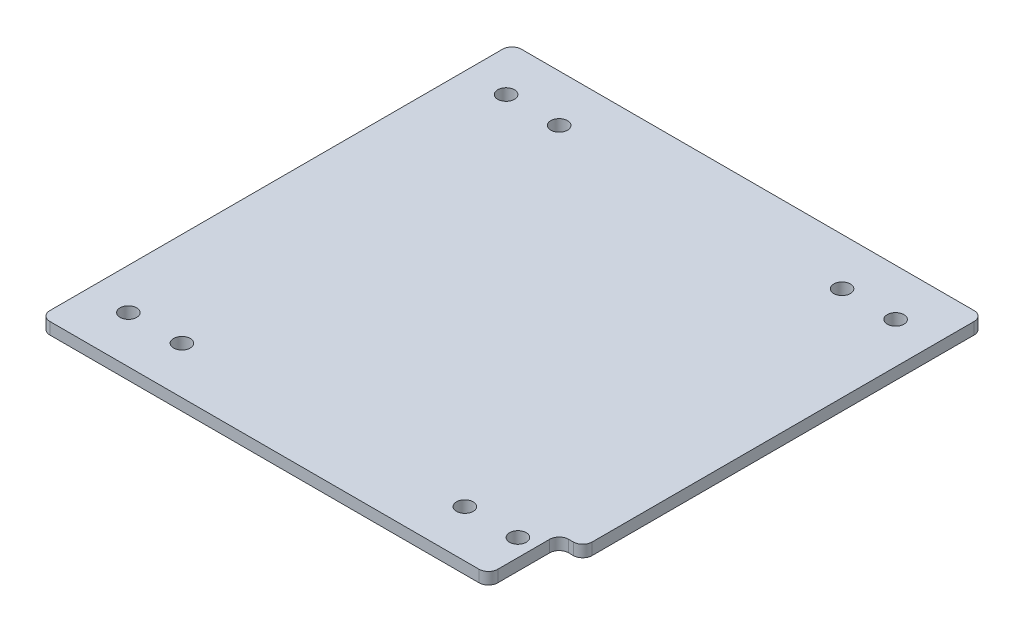
ISO-10303-21;
HEADER;
FILE_DESCRIPTION(('STEP AP214'),'2;1');
FILE_NAME('part.step','',(''),(''),'','','');
FILE_SCHEMA(('AUTOMOTIVE_DESIGN { 1 0 10303 214 1 1 1 1 }'));
ENDSEC;
DATA;
#1=APPLICATION_CONTEXT('core data for automotive mechanical design processes');
#2=APPLICATION_PROTOCOL_DEFINITION('international standard','automotive_design',2000,#1);
#3=PRODUCT_CONTEXT('',#1,'mechanical');
#4=PRODUCT('Part','Part','',(#3));
#5=PRODUCT_RELATED_PRODUCT_CATEGORY('part','',(#4));
#6=PRODUCT_DEFINITION_FORMATION('','',#4);
#7=PRODUCT_DEFINITION_CONTEXT('part definition',#1,'design');
#8=PRODUCT_DEFINITION('design','',#6,#7);
#9=PRODUCT_DEFINITION_SHAPE('','',#8);
#10=(LENGTH_UNIT() NAMED_UNIT(*) SI_UNIT(.MILLI.,.METRE.));
#11=(NAMED_UNIT(*) PLANE_ANGLE_UNIT() SI_UNIT($,.RADIAN.));
#12=(NAMED_UNIT(*) SI_UNIT($,.STERADIAN.) SOLID_ANGLE_UNIT());
#13=UNCERTAINTY_MEASURE_WITH_UNIT(LENGTH_MEASURE(1.E-05),#10,'distance_accuracy_value','');
#14=(GEOMETRIC_REPRESENTATION_CONTEXT(3) GLOBAL_UNCERTAINTY_ASSIGNED_CONTEXT((#13)) GLOBAL_UNIT_ASSIGNED_CONTEXT((#10,
#11,#12)) REPRESENTATION_CONTEXT('',''));
#15=CARTESIAN_POINT('',(0.,0.,0.));
#16=DIRECTION('',(0.,0.,1.));
#17=DIRECTION('',(1.,0.,0.));
#18=AXIS2_PLACEMENT_3D('',#15,#16,#17);
#19=CARTESIAN_POINT('',(21.6736429818213,3.175,-76.5060240963855));
#20=DIRECTION('',(-1.,0.,0.));
#21=DIRECTION('',(0.,0.,1.));
#22=AXIS2_PLACEMENT_3D('',#19,#20,#21);
#23=PLANE('',#22);
#24=DIRECTION('',(0.,0.,-1.));
#25=VECTOR('',#24,1.);
#26=CARTESIAN_POINT('',(21.6736429818213,3.175,-76.5060240963855));
#27=LINE('',#26,#25);
#28=CARTESIAN_POINT('',(21.6736429818213,3.175,28.9039759036145));
#29=VERTEX_POINT('',#28);
#30=CARTESIAN_POINT('',(21.6736429818213,3.175,-73.9660240963855));
#31=VERTEX_POINT('',#30);
#32=EDGE_CURVE('E210',#29,#31,#27,.T.);
#33=ORIENTED_EDGE('',*,*,#32,.F.);
#34=DIRECTION('',(0.,1.,0.));
#35=VECTOR('',#34,1.);
#36=CARTESIAN_POINT('',(21.6736429818213,3.175,28.9039759036145));
#37=LINE('',#36,#35);
#38=CARTESIAN_POINT('',(21.6736429818213,0.,28.9039759036145));
#39=VERTEX_POINT('',#38);
#40=EDGE_CURVE('E130',#29,#39,#37,.F.);
#41=ORIENTED_EDGE('',*,*,#40,.T.);
#42=DIRECTION('',(0.,0.,-1.));
#43=VECTOR('',#42,1.);
#44=CARTESIAN_POINT('',(21.6736429818213,0.,-76.5060240963855));
#45=LINE('',#44,#43);
#46=CARTESIAN_POINT('',(21.6736429818213,0.,-73.9660240963855));
#47=VERTEX_POINT('',#46);
#48=EDGE_CURVE('E209',#39,#47,#45,.T.);
#49=ORIENTED_EDGE('',*,*,#48,.T.);
#50=DIRECTION('',(0.,-1.,0.));
#51=VECTOR('',#50,1.);
#52=CARTESIAN_POINT('',(21.6736429818213,3.175,-73.9660240963855));
#53=LINE('',#52,#51);
#54=EDGE_CURVE('E135',#47,#31,#53,.F.);
#55=ORIENTED_EDGE('',*,*,#54,.T.);
#56=EDGE_LOOP('',(#33,#41,#49,#55));
#57=FACE_BOUND('',#56,.T.);
#58=ADVANCED_FACE('F35',(#57),#23,.F.);
#59=CARTESIAN_POINT('',(-105.326357018179,3.175,-76.5060240963855));
#60=DIRECTION('',(0.,0.,1.));
#61=DIRECTION('',(1.,0.,0.));
#62=AXIS2_PLACEMENT_3D('',#59,#60,#61);
#63=PLANE('',#62);
#64=DIRECTION('',(-1.,0.,0.));
#65=VECTOR('',#64,1.);
#66=CARTESIAN_POINT('',(-105.326357018179,3.175,-76.5060240963855));
#67=LINE('',#66,#65);
#68=CARTESIAN_POINT('',(19.1336429818213,3.175,-76.5060240963855));
#69=VERTEX_POINT('',#68);
#70=CARTESIAN_POINT('',(-102.786357018179,3.175,-76.5060240963855));
#71=VERTEX_POINT('',#70);
#72=EDGE_CURVE('E212',#69,#71,#67,.T.);
#73=ORIENTED_EDGE('',*,*,#72,.F.);
#74=DIRECTION('',(0.,-1.,0.));
#75=VECTOR('',#74,1.);
#76=CARTESIAN_POINT('',(19.1336429818213,3.175,-76.5060240963855));
#77=LINE('',#76,#75);
#78=CARTESIAN_POINT('',(19.1336429818213,0.,-76.5060240963855));
#79=VERTEX_POINT('',#78);
#80=EDGE_CURVE('E266',#69,#79,#77,.T.);
#81=ORIENTED_EDGE('',*,*,#80,.T.);
#82=DIRECTION('',(-1.,0.,0.));
#83=VECTOR('',#82,1.);
#84=CARTESIAN_POINT('',(-105.326357018179,0.,-76.5060240963855));
#85=LINE('',#84,#83);
#86=CARTESIAN_POINT('',(-102.786357018179,0.,-76.5060240963855));
#87=VERTEX_POINT('',#86);
#88=EDGE_CURVE('E224',#79,#87,#85,.T.);
#89=ORIENTED_EDGE('',*,*,#88,.T.);
#90=DIRECTION('',(0.,-1.,0.));
#91=VECTOR('',#90,1.);
#92=CARTESIAN_POINT('',(-102.786357018179,3.175,-76.5060240963855));
#93=LINE('',#92,#91);
#94=EDGE_CURVE('E264',#87,#71,#93,.F.);
#95=ORIENTED_EDGE('',*,*,#94,.T.);
#96=EDGE_LOOP('',(#73,#81,#89,#95));
#97=FACE_BOUND('',#96,.T.);
#98=ADVANCED_FACE('F269',(#97),#63,.F.);
#99=CARTESIAN_POINT('',(-105.326357018179,3.175,-76.5060240963855));
#100=DIRECTION('',(1.,0.,0.));
#101=DIRECTION('',(0.,0.,-1.));
#102=AXIS2_PLACEMENT_3D('',#99,#100,#101);
#103=PLANE('',#102);
#104=DIRECTION('',(0.,0.,1.));
#105=VECTOR('',#104,1.);
#106=CARTESIAN_POINT('',(-105.326357018179,0.,-76.5060240963855));
#107=LINE('',#106,#105);
#108=CARTESIAN_POINT('',(-105.326357018179,0.,-73.9660240963855));
#109=VERTEX_POINT('',#108);
#110=CARTESIAN_POINT('',(-105.326357018179,0.,47.9539759036145));
#111=VERTEX_POINT('',#110);
#112=EDGE_CURVE('E226',#109,#111,#107,.T.);
#113=ORIENTED_EDGE('',*,*,#112,.T.);
#114=DIRECTION('',(0.,-1.,0.));
#115=VECTOR('',#114,1.);
#116=CARTESIAN_POINT('',(-105.326357018179,3.175,47.9539759036145));
#117=LINE('',#116,#115);
#118=CARTESIAN_POINT('',(-105.326357018179,3.175,47.9539759036145));
#119=VERTEX_POINT('',#118);
#120=EDGE_CURVE('E262',#111,#119,#117,.F.);
#121=ORIENTED_EDGE('',*,*,#120,.T.);
#122=DIRECTION('',(0.,0.,1.));
#123=VECTOR('',#122,1.);
#124=CARTESIAN_POINT('',(-105.326357018179,3.175,-76.5060240963855));
#125=LINE('',#124,#123);
#126=CARTESIAN_POINT('',(-105.326357018179,3.175,-73.9660240963855));
#127=VERTEX_POINT('',#126);
#128=EDGE_CURVE('E216',#127,#119,#125,.T.);
#129=ORIENTED_EDGE('',*,*,#128,.F.);
#130=DIRECTION('',(0.,-1.,0.));
#131=VECTOR('',#130,1.);
#132=CARTESIAN_POINT('',(-105.326357018179,3.175,-73.9660240963855));
#133=LINE('',#132,#131);
#134=EDGE_CURVE('E259',#127,#109,#133,.T.);
#135=ORIENTED_EDGE('',*,*,#134,.T.);
#136=EDGE_LOOP('',(#113,#121,#129,#135));
#137=FACE_BOUND('',#136,.T.);
#138=ADVANCED_FACE('F281',(#137),#103,.F.);
#139=CARTESIAN_POINT('',(-105.326357018179,3.175,50.4939759036145));
#140=DIRECTION('',(0.,0.,-1.));
#141=DIRECTION('',(-1.,0.,0.));
#142=AXIS2_PLACEMENT_3D('',#139,#140,#141);
#143=PLANE('',#142);
#144=DIRECTION('',(1.,0.,0.));
#145=VECTOR('',#144,1.);
#146=CARTESIAN_POINT('',(-105.326357018179,0.,50.4939759036145));
#147=LINE('',#146,#145);
#148=CARTESIAN_POINT('',(-102.786357018179,0.,50.4939759036145));
#149=VERTEX_POINT('',#148);
#150=CARTESIAN_POINT('',(12.7836429818213,0.,50.4939759036145));
#151=VERTEX_POINT('',#150);
#152=EDGE_CURVE('E213',#149,#151,#147,.T.);
#153=ORIENTED_EDGE('',*,*,#152,.T.);
#154=DIRECTION('',(0.,1.,0.));
#155=VECTOR('',#154,1.);
#156=CARTESIAN_POINT('',(12.7836429818213,3.175,50.4939759036145));
#157=LINE('',#156,#155);
#158=CARTESIAN_POINT('',(12.7836429818213,3.175,50.4939759036145));
#159=VERTEX_POINT('',#158);
#160=EDGE_CURVE('E256',#151,#159,#157,.T.);
#161=ORIENTED_EDGE('',*,*,#160,.T.);
#162=DIRECTION('',(1.,0.,0.));
#163=VECTOR('',#162,1.);
#164=CARTESIAN_POINT('',(-105.326357018179,3.175,50.4939759036145));
#165=LINE('',#164,#163);
#166=CARTESIAN_POINT('',(-102.786357018179,3.175,50.4939759036145));
#167=VERTEX_POINT('',#166);
#168=EDGE_CURVE('E219',#167,#159,#165,.T.);
#169=ORIENTED_EDGE('',*,*,#168,.F.);
#170=DIRECTION('',(0.,-1.,0.));
#171=VECTOR('',#170,1.);
#172=CARTESIAN_POINT('',(-102.786357018179,3.175,50.4939759036145));
#173=LINE('',#172,#171);
#174=EDGE_CURVE('E253',#167,#149,#173,.T.);
#175=ORIENTED_EDGE('',*,*,#174,.T.);
#176=EDGE_LOOP('',(#153,#161,#169,#175));
#177=FACE_BOUND('',#176,.T.);
#178=ADVANCED_FACE('F290',(#177),#143,.F.);
#179=CARTESIAN_POINT('',(0.,3.175,0.));
#180=DIRECTION('',(0.,1.,0.));
#181=DIRECTION('',(0.,0.,1.));
#182=AXIS2_PLACEMENT_3D('',#179,#180,#181);
#183=PLANE('',#182);
#184=DIRECTION('',(-1.,0.,0.));
#185=VECTOR('',#184,1.);
#186=CARTESIAN_POINT('',(15.3236429818213,3.175,31.4439759036145));
#187=LINE('',#186,#185);
#188=CARTESIAN_POINT('',(19.1336429818213,3.175,31.4439759036145));
#189=VERTEX_POINT('',#188);
#190=CARTESIAN_POINT('',(17.8636429818213,3.175,31.4439759036145));
#191=VERTEX_POINT('',#190);
#192=EDGE_CURVE('E142',#189,#191,#187,.T.);
#193=ORIENTED_EDGE('',*,*,#192,.F.);
#194=CARTESIAN_POINT('',(19.1336429818213,3.175,28.9039759036145));
#195=DIRECTION('',(0.,1.,0.));
#196=DIRECTION('',(0.,0.,1.));
#197=AXIS2_PLACEMENT_3D('',#194,#195,#196);
#198=CIRCLE('',#197,2.54);
#199=EDGE_CURVE('E125',#189,#29,#198,.T.);
#200=ORIENTED_EDGE('',*,*,#199,.T.);
#201=ORIENTED_EDGE('',*,*,#32,.T.);
#202=CARTESIAN_POINT('',(19.1336429818213,3.175,-73.9660240963855));
#203=DIRECTION('',(0.,1.,0.));
#204=DIRECTION('',(0.,0.,1.));
#205=AXIS2_PLACEMENT_3D('',#202,#203,#204);
#206=CIRCLE('',#205,2.54);
#207=EDGE_CURVE('E233',#31,#69,#206,.T.);
#208=ORIENTED_EDGE('',*,*,#207,.T.);
#209=ORIENTED_EDGE('',*,*,#72,.T.);
#210=CARTESIAN_POINT('',(-102.786357018179,3.175,-73.9660240963855));
#211=DIRECTION('',(0.,1.,0.));
#212=DIRECTION('',(0.,0.,1.));
#213=AXIS2_PLACEMENT_3D('',#210,#211,#212);
#214=CIRCLE('',#213,2.54);
#215=EDGE_CURVE('E146',#71,#127,#214,.T.);
#216=ORIENTED_EDGE('',*,*,#215,.T.);
#217=ORIENTED_EDGE('',*,*,#128,.T.);
#218=CARTESIAN_POINT('',(-102.786357018179,3.175,47.9539759036145));
#219=DIRECTION('',(0.,1.,0.));
#220=DIRECTION('',(0.,0.,1.));
#221=AXIS2_PLACEMENT_3D('',#218,#219,#220);
#222=CIRCLE('',#221,2.54);
#223=EDGE_CURVE('E235',#119,#167,#222,.T.);
#224=ORIENTED_EDGE('',*,*,#223,.T.);
#225=ORIENTED_EDGE('',*,*,#168,.T.);
#226=CARTESIAN_POINT('',(12.7836429818213,3.175,47.9539759036145));
#227=DIRECTION('',(0.,1.,0.));
#228=DIRECTION('',(0.,0.,1.));
#229=AXIS2_PLACEMENT_3D('',#226,#227,#228);
#230=CIRCLE('',#229,2.54);
#231=CARTESIAN_POINT('',(15.3236429818213,3.175,47.9539759036145));
#232=VERTEX_POINT('',#231);
#233=EDGE_CURVE('E136',#159,#232,#230,.T.);
#234=ORIENTED_EDGE('',*,*,#233,.T.);
#235=DIRECTION('',(0.,0.,1.));
#236=VECTOR('',#235,1.);
#237=CARTESIAN_POINT('',(15.3236429818213,3.175,50.4939759036145));
#238=LINE('',#237,#236);
#239=CARTESIAN_POINT('',(15.3236429818213,3.175,33.9839759036145));
#240=VERTEX_POINT('',#239);
#241=EDGE_CURVE('E153',#240,#232,#238,.T.);
#242=ORIENTED_EDGE('',*,*,#241,.F.);
#243=CARTESIAN_POINT('',(17.8636429818213,3.175,33.9839759036145));
#244=DIRECTION('',(0.,1.,0.));
#245=DIRECTION('',(0.,0.,1.));
#246=AXIS2_PLACEMENT_3D('',#243,#244,#245);
#247=CIRCLE('',#246,2.54);
#248=EDGE_CURVE('E43',#240,#191,#247,.F.);
#249=ORIENTED_EDGE('',*,*,#248,.T.);
#250=EDGE_LOOP('',(#193,#200,#201,#208,#209,#216,#217,#224,#225,#234,#242,#249));
#251=FACE_BOUND('',#250,.T.);
#252=CARTESIAN_POINT('',(10.6246429818213,3.175,-63.8695240963855));
#253=DIRECTION('',(0.,-1.,0.));
#254=DIRECTION('',(0.,0.,-1.));
#255=AXIS2_PLACEMENT_3D('',#252,#253,#254);
#256=CIRCLE('',#255,2.2479);
#257=CARTESIAN_POINT('',(10.6246429818213,3.175,-66.1174240963855));
#258=VERTEX_POINT('',#257);
#259=EDGE_CURVE('E164',#258,#258,#256,.T.);
#260=ORIENTED_EDGE('',*,*,#259,.T.);
#261=EDGE_LOOP('',(#260));
#262=FACE_BOUND('',#261,.T.);
#263=CARTESIAN_POINT('',(-94.2773570181787,3.175,37.8574759036145));
#264=DIRECTION('',(0.,-1.,0.));
#265=DIRECTION('',(0.,0.,-1.));
#266=AXIS2_PLACEMENT_3D('',#263,#264,#265);
#267=CIRCLE('',#266,2.2479);
#268=CARTESIAN_POINT('',(-94.2773570181787,3.175,35.6095759036145));
#269=VERTEX_POINT('',#268);
#270=EDGE_CURVE('E170',#269,#269,#267,.T.);
#271=ORIENTED_EDGE('',*,*,#270,.T.);
#272=EDGE_LOOP('',(#271));
#273=FACE_BOUND('',#272,.T.);
#274=CARTESIAN_POINT('',(-94.2773570181787,3.175,-63.8695240963855));
#275=DIRECTION('',(0.,-1.,0.));
#276=DIRECTION('',(0.,0.,-1.));
#277=AXIS2_PLACEMENT_3D('',#274,#275,#276);
#278=CIRCLE('',#277,2.2479);
#279=CARTESIAN_POINT('',(-94.2773570181787,3.175,-66.1174240963855));
#280=VERTEX_POINT('',#279);
#281=EDGE_CURVE('E176',#280,#280,#278,.T.);
#282=ORIENTED_EDGE('',*,*,#281,.T.);
#283=EDGE_LOOP('',(#282));
#284=FACE_BOUND('',#283,.T.);
#285=CARTESIAN_POINT('',(10.6246429818213,3.175,37.8574759036145));
#286=DIRECTION('',(0.,-1.,0.));
#287=DIRECTION('',(0.,0.,-1.));
#288=AXIS2_PLACEMENT_3D('',#285,#286,#287);
#289=CIRCLE('',#288,2.2479);
#290=CARTESIAN_POINT('',(10.6246429818213,3.175,35.6095759036145));
#291=VERTEX_POINT('',#290);
#292=EDGE_CURVE('E182',#291,#291,#289,.T.);
#293=ORIENTED_EDGE('',*,*,#292,.T.);
#294=EDGE_LOOP('',(#293));
#295=FACE_BOUND('',#294,.T.);
#296=CARTESIAN_POINT('',(-3.72635701817868,3.175,-63.8060240963855));
#297=DIRECTION('',(0.,-1.,0.));
#298=DIRECTION('',(0.,0.,-1.));
#299=AXIS2_PLACEMENT_3D('',#296,#297,#298);
#300=CIRCLE('',#299,2.2479);
#301=CARTESIAN_POINT('',(-3.72635701817868,3.175,-66.0539240963855));
#302=VERTEX_POINT('',#301);
#303=EDGE_CURVE('E188',#302,#302,#300,.T.);
#304=ORIENTED_EDGE('',*,*,#303,.T.);
#305=EDGE_LOOP('',(#304));
#306=FACE_BOUND('',#305,.T.);
#307=CARTESIAN_POINT('',(-79.9263570181787,3.175,37.7939759036145));
#308=DIRECTION('',(0.,-1.,0.));
#309=DIRECTION('',(0.,0.,-1.));
#310=AXIS2_PLACEMENT_3D('',#307,#308,#309);
#311=CIRCLE('',#310,2.2479);
#312=CARTESIAN_POINT('',(-79.9263570181787,3.175,35.5460759036145));
#313=VERTEX_POINT('',#312);
#314=EDGE_CURVE('E194',#313,#313,#311,.T.);
#315=ORIENTED_EDGE('',*,*,#314,.T.);
#316=EDGE_LOOP('',(#315));
#317=FACE_BOUND('',#316,.T.);
#318=CARTESIAN_POINT('',(-79.9263570181787,3.175,-63.8060240963855));
#319=DIRECTION('',(0.,-1.,0.));
#320=DIRECTION('',(0.,0.,-1.));
#321=AXIS2_PLACEMENT_3D('',#318,#319,#320);
#322=CIRCLE('',#321,2.2479);
#323=CARTESIAN_POINT('',(-79.9263570181787,3.175,-66.0539240963855));
#324=VERTEX_POINT('',#323);
#325=EDGE_CURVE('E200',#324,#324,#322,.T.);
#326=ORIENTED_EDGE('',*,*,#325,.T.);
#327=EDGE_LOOP('',(#326));
#328=FACE_BOUND('',#327,.T.);
#329=CARTESIAN_POINT('',(-3.72635701817868,3.175,37.7939759036145));
#330=DIRECTION('',(0.,-1.,0.));
#331=DIRECTION('',(0.,0.,-1.));
#332=AXIS2_PLACEMENT_3D('',#329,#330,#331);
#333=CIRCLE('',#332,2.2479);
#334=CARTESIAN_POINT('',(-3.72635701817868,3.175,35.5460759036145));
#335=VERTEX_POINT('',#334);
#336=EDGE_CURVE('E206',#335,#335,#333,.T.);
#337=ORIENTED_EDGE('',*,*,#336,.T.);
#338=EDGE_LOOP('',(#337));
#339=FACE_BOUND('',#338,.T.);
#340=ADVANCED_FACE('F149',(#251,#262,#273,#284,#295,#306,#317,#328,#339),#183,.T.);
#341=CARTESIAN_POINT('',(0.,0.,0.));
#342=DIRECTION('',(0.,1.,0.));
#343=DIRECTION('',(0.,0.,1.));
#344=AXIS2_PLACEMENT_3D('',#341,#342,#343);
#345=PLANE('',#344);
#346=CARTESIAN_POINT('',(10.6246429818213,0.,-63.8695240963855));
#347=DIRECTION('',(0.,-1.,0.));
#348=DIRECTION('',(0.,0.,-1.));
#349=AXIS2_PLACEMENT_3D('',#346,#347,#348);
#350=CIRCLE('',#349,2.2479);
#351=CARTESIAN_POINT('',(10.6246429818213,0.,-66.1174240963855));
#352=VERTEX_POINT('',#351);
#353=EDGE_CURVE('E161',#352,#352,#350,.T.);
#354=ORIENTED_EDGE('',*,*,#353,.F.);
#355=EDGE_LOOP('',(#354));
#356=FACE_BOUND('',#355,.T.);
#357=CARTESIAN_POINT('',(-94.2773570181787,0.,37.8574759036145));
#358=DIRECTION('',(0.,-1.,0.));
#359=DIRECTION('',(0.,0.,-1.));
#360=AXIS2_PLACEMENT_3D('',#357,#358,#359);
#361=CIRCLE('',#360,2.2479);
#362=CARTESIAN_POINT('',(-94.2773570181787,0.,35.6095759036145));
#363=VERTEX_POINT('',#362);
#364=EDGE_CURVE('E167',#363,#363,#361,.T.);
#365=ORIENTED_EDGE('',*,*,#364,.F.);
#366=EDGE_LOOP('',(#365));
#367=FACE_BOUND('',#366,.T.);
#368=CARTESIAN_POINT('',(-94.2773570181787,0.,-63.8695240963855));
#369=DIRECTION('',(0.,-1.,0.));
#370=DIRECTION('',(0.,0.,-1.));
#371=AXIS2_PLACEMENT_3D('',#368,#369,#370);
#372=CIRCLE('',#371,2.2479);
#373=CARTESIAN_POINT('',(-94.2773570181787,0.,-66.1174240963855));
#374=VERTEX_POINT('',#373);
#375=EDGE_CURVE('E173',#374,#374,#372,.T.);
#376=ORIENTED_EDGE('',*,*,#375,.F.);
#377=EDGE_LOOP('',(#376));
#378=FACE_BOUND('',#377,.T.);
#379=CARTESIAN_POINT('',(10.6246429818213,0.,37.8574759036145));
#380=DIRECTION('',(0.,-1.,0.));
#381=DIRECTION('',(0.,0.,-1.));
#382=AXIS2_PLACEMENT_3D('',#379,#380,#381);
#383=CIRCLE('',#382,2.2479);
#384=CARTESIAN_POINT('',(10.6246429818213,0.,35.6095759036145));
#385=VERTEX_POINT('',#384);
#386=EDGE_CURVE('E179',#385,#385,#383,.T.);
#387=ORIENTED_EDGE('',*,*,#386,.F.);
#388=EDGE_LOOP('',(#387));
#389=FACE_BOUND('',#388,.T.);
#390=CARTESIAN_POINT('',(-3.72635701817868,0.,-63.8060240963855));
#391=DIRECTION('',(0.,-1.,0.));
#392=DIRECTION('',(0.,0.,-1.));
#393=AXIS2_PLACEMENT_3D('',#390,#391,#392);
#394=CIRCLE('',#393,2.24789999999999);
#395=CARTESIAN_POINT('',(-3.72635701817868,0.,-66.0539240963855));
#396=VERTEX_POINT('',#395);
#397=EDGE_CURVE('E185',#396,#396,#394,.T.);
#398=ORIENTED_EDGE('',*,*,#397,.F.);
#399=EDGE_LOOP('',(#398));
#400=FACE_BOUND('',#399,.T.);
#401=CARTESIAN_POINT('',(-79.9263570181787,0.,37.7939759036145));
#402=DIRECTION('',(0.,-1.,0.));
#403=DIRECTION('',(0.,0.,-1.));
#404=AXIS2_PLACEMENT_3D('',#401,#402,#403);
#405=CIRCLE('',#404,2.24789999999998);
#406=CARTESIAN_POINT('',(-79.9263570181787,0.,35.5460759036145));
#407=VERTEX_POINT('',#406);
#408=EDGE_CURVE('E191',#407,#407,#405,.T.);
#409=ORIENTED_EDGE('',*,*,#408,.F.);
#410=EDGE_LOOP('',(#409));
#411=FACE_BOUND('',#410,.T.);
#412=CARTESIAN_POINT('',(-79.9263570181787,0.,-63.8060240963855));
#413=DIRECTION('',(0.,-1.,0.));
#414=DIRECTION('',(0.,0.,-1.));
#415=AXIS2_PLACEMENT_3D('',#412,#413,#414);
#416=CIRCLE('',#415,2.24789999999998);
#417=CARTESIAN_POINT('',(-79.9263570181787,0.,-66.0539240963855));
#418=VERTEX_POINT('',#417);
#419=EDGE_CURVE('E197',#418,#418,#416,.T.);
#420=ORIENTED_EDGE('',*,*,#419,.F.);
#421=EDGE_LOOP('',(#420));
#422=FACE_BOUND('',#421,.T.);
#423=CARTESIAN_POINT('',(-3.72635701817868,0.,37.7939759036145));
#424=DIRECTION('',(0.,-1.,0.));
#425=DIRECTION('',(0.,0.,-1.));
#426=AXIS2_PLACEMENT_3D('',#423,#424,#425);
#427=CIRCLE('',#426,2.24789999999999);
#428=CARTESIAN_POINT('',(-3.72635701817868,0.,35.5460759036145));
#429=VERTEX_POINT('',#428);
#430=EDGE_CURVE('E203',#429,#429,#427,.T.);
#431=ORIENTED_EDGE('',*,*,#430,.F.);
#432=EDGE_LOOP('',(#431));
#433=FACE_BOUND('',#432,.T.);
#434=ORIENTED_EDGE('',*,*,#48,.F.);
#435=CARTESIAN_POINT('',(19.1336429818213,0.,28.9039759036145));
#436=DIRECTION('',(0.,1.,0.));
#437=DIRECTION('',(0.,0.,1.));
#438=AXIS2_PLACEMENT_3D('',#435,#436,#437);
#439=CIRCLE('',#438,2.54);
#440=CARTESIAN_POINT('',(19.1336429818213,0.,31.4439759036145));
#441=VERTEX_POINT('',#440);
#442=EDGE_CURVE('E246',#39,#441,#439,.F.);
#443=ORIENTED_EDGE('',*,*,#442,.T.);
#444=DIRECTION('',(-1.,0.,0.));
#445=VECTOR('',#444,1.);
#446=CARTESIAN_POINT('',(15.3236429818213,0.,31.4439759036145));
#447=LINE('',#446,#445);
#448=CARTESIAN_POINT('',(17.8636429818213,0.,31.4439759036145));
#449=VERTEX_POINT('',#448);
#450=EDGE_CURVE('E145',#441,#449,#447,.T.);
#451=ORIENTED_EDGE('',*,*,#450,.T.);
#452=CARTESIAN_POINT('',(17.8636429818213,0.,33.9839759036145));
#453=DIRECTION('',(0.,1.,0.));
#454=DIRECTION('',(0.,0.,1.));
#455=AXIS2_PLACEMENT_3D('',#452,#453,#454);
#456=CIRCLE('',#455,2.54);
#457=CARTESIAN_POINT('',(15.3236429818213,0.,33.9839759036145));
#458=VERTEX_POINT('',#457);
#459=EDGE_CURVE('E11',#449,#458,#456,.T.);
#460=ORIENTED_EDGE('',*,*,#459,.T.);
#461=DIRECTION('',(0.,0.,1.));
#462=VECTOR('',#461,1.);
#463=CARTESIAN_POINT('',(15.3236429818213,0.,50.4939759036145));
#464=LINE('',#463,#462);
#465=CARTESIAN_POINT('',(15.3236429818213,0.,47.9539759036145));
#466=VERTEX_POINT('',#465);
#467=EDGE_CURVE('E152',#458,#466,#464,.T.);
#468=ORIENTED_EDGE('',*,*,#467,.T.);
#469=CARTESIAN_POINT('',(12.7836429818213,0.,47.9539759036145));
#470=DIRECTION('',(0.,1.,0.));
#471=DIRECTION('',(0.,0.,1.));
#472=AXIS2_PLACEMENT_3D('',#469,#470,#471);
#473=CIRCLE('',#472,2.54);
#474=EDGE_CURVE('E244',#466,#151,#473,.F.);
#475=ORIENTED_EDGE('',*,*,#474,.T.);
#476=ORIENTED_EDGE('',*,*,#152,.F.);
#477=CARTESIAN_POINT('',(-102.786357018179,0.,47.9539759036145));
#478=DIRECTION('',(0.,1.,0.));
#479=DIRECTION('',(0.,0.,1.));
#480=AXIS2_PLACEMENT_3D('',#477,#478,#479);
#481=CIRCLE('',#480,2.54);
#482=EDGE_CURVE('E242',#149,#111,#481,.F.);
#483=ORIENTED_EDGE('',*,*,#482,.T.);
#484=ORIENTED_EDGE('',*,*,#112,.F.);
#485=CARTESIAN_POINT('',(-102.786357018179,0.,-73.9660240963855));
#486=DIRECTION('',(0.,1.,0.));
#487=DIRECTION('',(0.,0.,1.));
#488=AXIS2_PLACEMENT_3D('',#485,#486,#487);
#489=CIRCLE('',#488,2.54);
#490=EDGE_CURVE('E50',#109,#87,#489,.F.);
#491=ORIENTED_EDGE('',*,*,#490,.T.);
#492=ORIENTED_EDGE('',*,*,#88,.F.);
#493=CARTESIAN_POINT('',(19.1336429818213,0.,-73.9660240963855));
#494=DIRECTION('',(0.,1.,0.));
#495=DIRECTION('',(0.,0.,1.));
#496=AXIS2_PLACEMENT_3D('',#493,#494,#495);
#497=CIRCLE('',#496,2.54);
#498=EDGE_CURVE('E58',#79,#47,#497,.F.);
#499=ORIENTED_EDGE('',*,*,#498,.T.);
#500=EDGE_LOOP('',(#434,#443,#451,#460,#468,#475,#476,#483,#484,#491,#492,#499));
#501=FACE_BOUND('',#500,.T.);
#502=ADVANCED_FACE('F273',(#356,#367,#378,#389,#400,#411,#422,#433,#501),#345,.F.);
#503=CARTESIAN_POINT('',(-3.72635701817868,0.,37.7939759036145));
#504=DIRECTION('',(0.,-1.,0.));
#505=DIRECTION('',(0.,0.,-1.));
#506=AXIS2_PLACEMENT_3D('',#503,#504,#505);
#507=CYLINDRICAL_SURFACE('',#506,2.24789999999999);
#508=ORIENTED_EDGE('',*,*,#336,.F.);
#509=EDGE_LOOP('',(#508));
#510=FACE_BOUND('',#509,.T.);
#511=ORIENTED_EDGE('',*,*,#430,.T.);
#512=EDGE_LOOP('',(#511));
#513=FACE_BOUND('',#512,.T.);
#514=ADVANCED_FACE('F324',(#510,#513),#507,.F.);
#515=CARTESIAN_POINT('',(-79.9263570181787,0.,-63.8060240963855));
#516=DIRECTION('',(0.,-1.,0.));
#517=DIRECTION('',(0.,0.,-1.));
#518=AXIS2_PLACEMENT_3D('',#515,#516,#517);
#519=CYLINDRICAL_SURFACE('',#518,2.24789999999999);
#520=ORIENTED_EDGE('',*,*,#325,.F.);
#521=EDGE_LOOP('',(#520));
#522=FACE_BOUND('',#521,.T.);
#523=ORIENTED_EDGE('',*,*,#419,.T.);
#524=EDGE_LOOP('',(#523));
#525=FACE_BOUND('',#524,.T.);
#526=ADVANCED_FACE('F330',(#522,#525),#519,.F.);
#527=CARTESIAN_POINT('',(-79.9263570181787,0.,37.7939759036145));
#528=DIRECTION('',(0.,-1.,0.));
#529=DIRECTION('',(0.,0.,-1.));
#530=AXIS2_PLACEMENT_3D('',#527,#528,#529);
#531=CYLINDRICAL_SURFACE('',#530,2.24789999999999);
#532=ORIENTED_EDGE('',*,*,#314,.F.);
#533=EDGE_LOOP('',(#532));
#534=FACE_BOUND('',#533,.T.);
#535=ORIENTED_EDGE('',*,*,#408,.T.);
#536=EDGE_LOOP('',(#535));
#537=FACE_BOUND('',#536,.T.);
#538=ADVANCED_FACE('F334',(#534,#537),#531,.F.);
#539=CARTESIAN_POINT('',(-3.72635701817868,0.,-63.8060240963855));
#540=DIRECTION('',(0.,-1.,0.));
#541=DIRECTION('',(0.,0.,-1.));
#542=AXIS2_PLACEMENT_3D('',#539,#540,#541);
#543=CYLINDRICAL_SURFACE('',#542,2.24789999999999);
#544=ORIENTED_EDGE('',*,*,#303,.F.);
#545=EDGE_LOOP('',(#544));
#546=FACE_BOUND('',#545,.T.);
#547=ORIENTED_EDGE('',*,*,#397,.T.);
#548=EDGE_LOOP('',(#547));
#549=FACE_BOUND('',#548,.T.);
#550=ADVANCED_FACE('F338',(#546,#549),#543,.F.);
#551=CARTESIAN_POINT('',(10.6246429818213,0.,37.8574759036145));
#552=DIRECTION('',(0.,-1.,0.));
#553=DIRECTION('',(0.,0.,-1.));
#554=AXIS2_PLACEMENT_3D('',#551,#552,#553);
#555=CYLINDRICAL_SURFACE('',#554,2.2479);
#556=ORIENTED_EDGE('',*,*,#292,.F.);
#557=EDGE_LOOP('',(#556));
#558=FACE_BOUND('',#557,.T.);
#559=ORIENTED_EDGE('',*,*,#386,.T.);
#560=EDGE_LOOP('',(#559));
#561=FACE_BOUND('',#560,.T.);
#562=ADVANCED_FACE('F342',(#558,#561),#555,.F.);
#563=CARTESIAN_POINT('',(-94.2773570181787,0.,-63.8695240963855));
#564=DIRECTION('',(0.,-1.,0.));
#565=DIRECTION('',(0.,0.,-1.));
#566=AXIS2_PLACEMENT_3D('',#563,#564,#565);
#567=CYLINDRICAL_SURFACE('',#566,2.2479);
#568=ORIENTED_EDGE('',*,*,#281,.F.);
#569=EDGE_LOOP('',(#568));
#570=FACE_BOUND('',#569,.T.);
#571=ORIENTED_EDGE('',*,*,#375,.T.);
#572=EDGE_LOOP('',(#571));
#573=FACE_BOUND('',#572,.T.);
#574=ADVANCED_FACE('F346',(#570,#573),#567,.F.);
#575=CARTESIAN_POINT('',(-94.2773570181787,0.,37.8574759036145));
#576=DIRECTION('',(0.,-1.,0.));
#577=DIRECTION('',(0.,0.,-1.));
#578=AXIS2_PLACEMENT_3D('',#575,#576,#577);
#579=CYLINDRICAL_SURFACE('',#578,2.2479);
#580=ORIENTED_EDGE('',*,*,#270,.F.);
#581=EDGE_LOOP('',(#580));
#582=FACE_BOUND('',#581,.T.);
#583=ORIENTED_EDGE('',*,*,#364,.T.);
#584=EDGE_LOOP('',(#583));
#585=FACE_BOUND('',#584,.T.);
#586=ADVANCED_FACE('F350',(#582,#585),#579,.F.);
#587=CARTESIAN_POINT('',(10.6246429818213,0.,-63.8695240963855));
#588=DIRECTION('',(0.,-1.,0.));
#589=DIRECTION('',(0.,0.,-1.));
#590=AXIS2_PLACEMENT_3D('',#587,#588,#589);
#591=CYLINDRICAL_SURFACE('',#590,2.2479);
#592=ORIENTED_EDGE('',*,*,#259,.F.);
#593=EDGE_LOOP('',(#592));
#594=FACE_BOUND('',#593,.T.);
#595=ORIENTED_EDGE('',*,*,#353,.T.);
#596=EDGE_LOOP('',(#595));
#597=FACE_BOUND('',#596,.T.);
#598=ADVANCED_FACE('F354',(#594,#597),#591,.F.);
#599=CARTESIAN_POINT('',(15.3236429818213,0.,50.4939759036145));
#600=DIRECTION('',(-1.,0.,0.));
#601=DIRECTION('',(0.,0.,1.));
#602=AXIS2_PLACEMENT_3D('',#599,#600,#601);
#603=PLANE('',#602);
#604=ORIENTED_EDGE('',*,*,#467,.F.);
#605=DIRECTION('',(0.,1.,0.));
#606=VECTOR('',#605,1.);
#607=CARTESIAN_POINT('',(15.3236429818213,3.175,33.9839759036145));
#608=LINE('',#607,#606);
#609=EDGE_CURVE('E250',#458,#240,#608,.T.);
#610=ORIENTED_EDGE('',*,*,#609,.T.);
#611=ORIENTED_EDGE('',*,*,#241,.T.);
#612=DIRECTION('',(0.,1.,0.));
#613=VECTOR('',#612,1.);
#614=CARTESIAN_POINT('',(15.3236429818213,0.,47.9539759036145));
#615=LINE('',#614,#613);
#616=EDGE_CURVE('E248',#232,#466,#615,.F.);
#617=ORIENTED_EDGE('',*,*,#616,.T.);
#618=EDGE_LOOP('',(#604,#610,#611,#617));
#619=FACE_BOUND('',#618,.T.);
#620=ADVANCED_FACE('F296',(#619),#603,.F.);
#621=CARTESIAN_POINT('',(15.3236429818213,0.,31.4439759036145));
#622=DIRECTION('',(0.,0.,-1.));
#623=DIRECTION('',(-1.,0.,0.));
#624=AXIS2_PLACEMENT_3D('',#621,#622,#623);
#625=PLANE('',#624);
#626=ORIENTED_EDGE('',*,*,#450,.F.);
#627=DIRECTION('',(0.,1.,0.));
#628=VECTOR('',#627,1.);
#629=CARTESIAN_POINT('',(19.1336429818213,0.,31.4439759036145));
#630=LINE('',#629,#628);
#631=EDGE_CURVE('E129',#441,#189,#630,.T.);
#632=ORIENTED_EDGE('',*,*,#631,.T.);
#633=ORIENTED_EDGE('',*,*,#192,.T.);
#634=DIRECTION('',(0.,1.,0.));
#635=VECTOR('',#634,1.);
#636=CARTESIAN_POINT('',(17.8636429818213,0.,31.4439759036145));
#637=LINE('',#636,#635);
#638=EDGE_CURVE('E147',#191,#449,#637,.F.);
#639=ORIENTED_EDGE('',*,*,#638,.T.);
#640=EDGE_LOOP('',(#626,#632,#633,#639));
#641=FACE_BOUND('',#640,.T.);
#642=ADVANCED_FACE('F141',(#641),#625,.F.);
#643=CARTESIAN_POINT('',(19.1336429818213,0.,28.9039759036145));
#644=DIRECTION('',(0.,1.,0.));
#645=DIRECTION('',(0.,0.,1.));
#646=AXIS2_PLACEMENT_3D('',#643,#644,#645);
#647=CYLINDRICAL_SURFACE('',#646,2.54);
#648=ORIENTED_EDGE('',*,*,#442,.F.);
#649=ORIENTED_EDGE('',*,*,#40,.F.);
#650=ORIENTED_EDGE('',*,*,#199,.F.);
#651=ORIENTED_EDGE('',*,*,#631,.F.);
#652=EDGE_LOOP('',(#648,#649,#650,#651));
#653=FACE_BOUND('',#652,.T.);
#654=ADVANCED_FACE('F128',(#653),#647,.T.);
#655=CARTESIAN_POINT('',(17.8636429818213,0.,33.9839759036145));
#656=DIRECTION('',(0.,-1.,0.));
#657=DIRECTION('',(0.,0.,-1.));
#658=AXIS2_PLACEMENT_3D('',#655,#656,#657);
#659=CYLINDRICAL_SURFACE('',#658,2.54);
#660=ORIENTED_EDGE('',*,*,#459,.F.);
#661=ORIENTED_EDGE('',*,*,#638,.F.);
#662=ORIENTED_EDGE('',*,*,#248,.F.);
#663=ORIENTED_EDGE('',*,*,#609,.F.);
#664=EDGE_LOOP('',(#660,#661,#662,#663));
#665=FACE_BOUND('',#664,.T.);
#666=ADVANCED_FACE('F302',(#665),#659,.F.);
#667=CARTESIAN_POINT('',(12.7836429818213,3.175,47.9539759036145));
#668=DIRECTION('',(0.,1.,0.));
#669=DIRECTION('',(0.,0.,1.));
#670=AXIS2_PLACEMENT_3D('',#667,#668,#669);
#671=CYLINDRICAL_SURFACE('',#670,2.54);
#672=ORIENTED_EDGE('',*,*,#474,.F.);
#673=ORIENTED_EDGE('',*,*,#616,.F.);
#674=ORIENTED_EDGE('',*,*,#233,.F.);
#675=ORIENTED_EDGE('',*,*,#160,.F.);
#676=EDGE_LOOP('',(#672,#673,#674,#675));
#677=FACE_BOUND('',#676,.T.);
#678=ADVANCED_FACE('F299',(#677),#671,.T.);
#679=CARTESIAN_POINT('',(-102.786357018179,3.175,47.9539759036145));
#680=DIRECTION('',(0.,-1.,0.));
#681=DIRECTION('',(0.,0.,-1.));
#682=AXIS2_PLACEMENT_3D('',#679,#680,#681);
#683=CYLINDRICAL_SURFACE('',#682,2.54);
#684=ORIENTED_EDGE('',*,*,#223,.F.);
#685=ORIENTED_EDGE('',*,*,#120,.F.);
#686=ORIENTED_EDGE('',*,*,#482,.F.);
#687=ORIENTED_EDGE('',*,*,#174,.F.);
#688=EDGE_LOOP('',(#684,#685,#686,#687));
#689=FACE_BOUND('',#688,.T.);
#690=ADVANCED_FACE('F287',(#689),#683,.T.);
#691=CARTESIAN_POINT('',(19.1336429818213,3.175,-73.9660240963855));
#692=DIRECTION('',(0.,-1.,0.));
#693=DIRECTION('',(0.,0.,-1.));
#694=AXIS2_PLACEMENT_3D('',#691,#692,#693);
#695=CYLINDRICAL_SURFACE('',#694,2.54);
#696=ORIENTED_EDGE('',*,*,#207,.F.);
#697=ORIENTED_EDGE('',*,*,#54,.F.);
#698=ORIENTED_EDGE('',*,*,#498,.F.);
#699=ORIENTED_EDGE('',*,*,#80,.F.);
#700=EDGE_LOOP('',(#696,#697,#698,#699));
#701=FACE_BOUND('',#700,.T.);
#702=ADVANCED_FACE('F275',(#701),#695,.T.);
#703=CARTESIAN_POINT('',(-102.786357018179,3.175,-73.9660240963855));
#704=DIRECTION('',(0.,-1.,0.));
#705=DIRECTION('',(0.,0.,-1.));
#706=AXIS2_PLACEMENT_3D('',#703,#704,#705);
#707=CYLINDRICAL_SURFACE('',#706,2.54);
#708=ORIENTED_EDGE('',*,*,#215,.F.);
#709=ORIENTED_EDGE('',*,*,#94,.F.);
#710=ORIENTED_EDGE('',*,*,#490,.F.);
#711=ORIENTED_EDGE('',*,*,#134,.F.);
#712=EDGE_LOOP('',(#708,#709,#710,#711));
#713=FACE_BOUND('',#712,.T.);
#714=ADVANCED_FACE('F37',(#713),#707,.T.);
#715=CLOSED_SHELL('',(#58,#98,#138,#178,#340,#502,#514,#526,#538,#550,#562,#574,#586,#598,#620,
#642,#654,#666,#678,#690,#702,#714));
#716=MANIFOLD_SOLID_BREP('B2',#715);
#717=ADVANCED_BREP_SHAPE_REPRESENTATION('',(#18,#716),#14);
#718=SHAPE_DEFINITION_REPRESENTATION(#9,#717);
ENDSEC;
END-ISO-10303-21;
